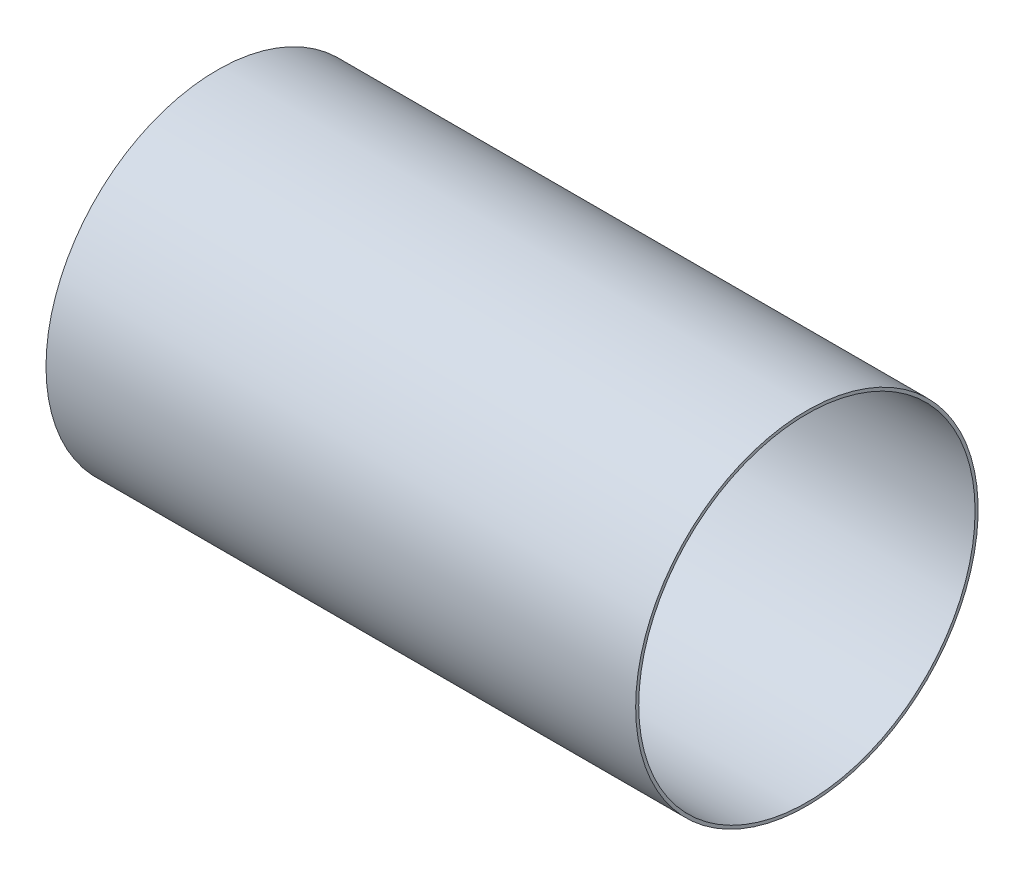
ISO-10303-21;
HEADER;
FILE_DESCRIPTION(('STEP AP214'),'2;1');
FILE_NAME('part.step','',(''),(''),'','','');
FILE_SCHEMA(('AUTOMOTIVE_DESIGN { 1 0 10303 214 1 1 1 1 }'));
ENDSEC;
DATA;
#1=APPLICATION_CONTEXT('core data for automotive mechanical design processes');
#2=APPLICATION_PROTOCOL_DEFINITION('international standard','automotive_design',2000,#1);
#3=PRODUCT_CONTEXT('',#1,'mechanical');
#4=PRODUCT('Part','Part','',(#3));
#5=PRODUCT_RELATED_PRODUCT_CATEGORY('part','',(#4));
#6=PRODUCT_DEFINITION_FORMATION('','',#4);
#7=PRODUCT_DEFINITION_CONTEXT('part definition',#1,'design');
#8=PRODUCT_DEFINITION('design','',#6,#7);
#9=PRODUCT_DEFINITION_SHAPE('','',#8);
#10=(LENGTH_UNIT() NAMED_UNIT(*) SI_UNIT(.MILLI.,.METRE.));
#11=(NAMED_UNIT(*) PLANE_ANGLE_UNIT() SI_UNIT($,.RADIAN.));
#12=(NAMED_UNIT(*) SI_UNIT($,.STERADIAN.) SOLID_ANGLE_UNIT());
#13=UNCERTAINTY_MEASURE_WITH_UNIT(LENGTH_MEASURE(1.E-05),#10,'distance_accuracy_value','');
#14=(GEOMETRIC_REPRESENTATION_CONTEXT(3) GLOBAL_UNCERTAINTY_ASSIGNED_CONTEXT((#13)) GLOBAL_UNIT_ASSIGNED_CONTEXT((#10,
#11,#12)) REPRESENTATION_CONTEXT('',''));
#15=CARTESIAN_POINT('',(0.,0.,0.));
#16=DIRECTION('',(0.,0.,1.));
#17=DIRECTION('',(1.,0.,0.));
#18=AXIS2_PLACEMENT_3D('',#15,#16,#17);
#19=CARTESIAN_POINT('',(304.8,0.,0.));
#20=DIRECTION('',(1.,0.,0.));
#21=DIRECTION('',(0.,0.,-1.));
#22=AXIS2_PLACEMENT_3D('',#19,#20,#21);
#23=PLANE('',#22);
#24=CARTESIAN_POINT('',(304.8,0.,0.));
#25=DIRECTION('',(1.,0.,0.));
#26=DIRECTION('',(0.,0.,-1.));
#27=AXIS2_PLACEMENT_3D('',#24,#25,#26);
#28=CIRCLE('',#27,88.519);
#29=CARTESIAN_POINT('',(304.8,0.,88.519));
#30=VERTEX_POINT('',#29);
#31=EDGE_CURVE('E10',#30,#30,#28,.T.);
#32=ORIENTED_EDGE('',*,*,#31,.T.);
#33=EDGE_LOOP('',(#32));
#34=FACE_BOUND('',#33,.T.);
#35=CARTESIAN_POINT('',(304.8,0.,0.));
#36=DIRECTION('',(1.,0.,0.));
#37=DIRECTION('',(0.,0.,-1.));
#38=AXIS2_PLACEMENT_3D('',#35,#36,#37);
#39=CIRCLE('',#38,86.9315);
#40=CARTESIAN_POINT('',(304.8,0.,86.9315));
#41=VERTEX_POINT('',#40);
#42=EDGE_CURVE('E56',#41,#41,#39,.T.);
#43=ORIENTED_EDGE('',*,*,#42,.F.);
#44=EDGE_LOOP('',(#43));
#45=FACE_BOUND('',#44,.T.);
#46=ADVANCED_FACE('F43',(#34,#45),#23,.T.);
#47=CARTESIAN_POINT('',(0.,0.,0.));
#48=DIRECTION('',(1.,0.,0.));
#49=DIRECTION('',(0.,0.,-1.));
#50=AXIS2_PLACEMENT_3D('',#47,#48,#49);
#51=PLANE('',#50);
#52=CARTESIAN_POINT('',(0.,0.,0.));
#53=DIRECTION('',(1.,0.,0.));
#54=DIRECTION('',(0.,0.,-1.));
#55=AXIS2_PLACEMENT_3D('',#52,#53,#54);
#56=CIRCLE('',#55,88.519);
#57=CARTESIAN_POINT('',(0.,0.,88.519));
#58=VERTEX_POINT('',#57);
#59=EDGE_CURVE('E47',#58,#58,#56,.T.);
#60=ORIENTED_EDGE('',*,*,#59,.F.);
#61=EDGE_LOOP('',(#60));
#62=FACE_BOUND('',#61,.T.);
#63=CARTESIAN_POINT('',(0.,0.,0.));
#64=DIRECTION('',(1.,0.,0.));
#65=DIRECTION('',(0.,0.,-1.));
#66=AXIS2_PLACEMENT_3D('',#63,#64,#65);
#67=CIRCLE('',#66,86.9315);
#68=CARTESIAN_POINT('',(0.,0.,86.9315));
#69=VERTEX_POINT('',#68);
#70=EDGE_CURVE('E58',#69,#69,#67,.T.);
#71=ORIENTED_EDGE('',*,*,#70,.T.);
#72=EDGE_LOOP('',(#71));
#73=FACE_BOUND('',#72,.T.);
#74=ADVANCED_FACE('F70',(#62,#73),#51,.F.);
#75=CARTESIAN_POINT('',(304.8,0.,0.));
#76=DIRECTION('',(-1.,0.,0.));
#77=DIRECTION('',(0.,0.,1.));
#78=AXIS2_PLACEMENT_3D('',#75,#76,#77);
#79=CYLINDRICAL_SURFACE('',#78,88.519);
#80=CARTESIAN_POINT('',(304.8,0.,88.519));
#81=CARTESIAN_POINT('',(301.625,0.,88.519));
#82=CARTESIAN_POINT('',(298.45,0.,88.519));
#83=CARTESIAN_POINT('',(292.1,0.,88.519));
#84=CARTESIAN_POINT('',(288.925,0.,88.519));
#85=CARTESIAN_POINT('',(282.575,0.,88.519));
#86=CARTESIAN_POINT('',(279.4,0.,88.519));
#87=CARTESIAN_POINT('',(273.05,0.,88.519));
#88=CARTESIAN_POINT('',(269.875,0.,88.519));
#89=CARTESIAN_POINT('',(263.525,0.,88.519));
#90=CARTESIAN_POINT('',(260.35,0.,88.519));
#91=CARTESIAN_POINT('',(254.,0.,88.519));
#92=CARTESIAN_POINT('',(250.825,0.,88.519));
#93=CARTESIAN_POINT('',(244.475,0.,88.519));
#94=CARTESIAN_POINT('',(241.3,0.,88.519));
#95=CARTESIAN_POINT('',(234.95,0.,88.519));
#96=CARTESIAN_POINT('',(231.775,0.,88.519));
#97=CARTESIAN_POINT('',(225.425,0.,88.519));
#98=CARTESIAN_POINT('',(222.25,0.,88.519));
#99=CARTESIAN_POINT('',(215.9,0.,88.519));
#100=CARTESIAN_POINT('',(212.725,0.,88.519));
#101=CARTESIAN_POINT('',(206.375,0.,88.519));
#102=CARTESIAN_POINT('',(203.2,0.,88.519));
#103=CARTESIAN_POINT('',(196.85,0.,88.519));
#104=CARTESIAN_POINT('',(193.675,0.,88.519));
#105=CARTESIAN_POINT('',(187.325,0.,88.519));
#106=CARTESIAN_POINT('',(184.15,0.,88.519));
#107=CARTESIAN_POINT('',(177.8,0.,88.519));
#108=CARTESIAN_POINT('',(174.625,0.,88.519));
#109=CARTESIAN_POINT('',(168.275,0.,88.519));
#110=CARTESIAN_POINT('',(165.1,0.,88.519));
#111=CARTESIAN_POINT('',(158.75,0.,88.519));
#112=CARTESIAN_POINT('',(155.575,0.,88.519));
#113=CARTESIAN_POINT('',(149.225,0.,88.519));
#114=CARTESIAN_POINT('',(146.05,0.,88.519));
#115=CARTESIAN_POINT('',(139.7,0.,88.519));
#116=CARTESIAN_POINT('',(136.525,0.,88.519));
#117=CARTESIAN_POINT('',(130.175,0.,88.519));
#118=CARTESIAN_POINT('',(127.,0.,88.519));
#119=CARTESIAN_POINT('',(120.65,0.,88.519));
#120=CARTESIAN_POINT('',(117.475,0.,88.519));
#121=CARTESIAN_POINT('',(111.125,0.,88.519));
#122=CARTESIAN_POINT('',(107.95,0.,88.519));
#123=CARTESIAN_POINT('',(101.6,0.,88.519));
#124=CARTESIAN_POINT('',(98.425,0.,88.519));
#125=CARTESIAN_POINT('',(92.075,0.,88.519));
#126=CARTESIAN_POINT('',(88.9,0.,88.519));
#127=CARTESIAN_POINT('',(82.55,0.,88.519));
#128=CARTESIAN_POINT('',(79.375,0.,88.519));
#129=CARTESIAN_POINT('',(73.025,0.,88.519));
#130=CARTESIAN_POINT('',(69.85,0.,88.519));
#131=CARTESIAN_POINT('',(63.5,0.,88.519));
#132=CARTESIAN_POINT('',(60.325,0.,88.519));
#133=CARTESIAN_POINT('',(53.975,0.,88.519));
#134=CARTESIAN_POINT('',(50.8,0.,88.519));
#135=CARTESIAN_POINT('',(44.45,0.,88.519));
#136=CARTESIAN_POINT('',(41.275,0.,88.519));
#137=CARTESIAN_POINT('',(34.925,0.,88.519));
#138=CARTESIAN_POINT('',(31.75,0.,88.519));
#139=CARTESIAN_POINT('',(25.4,0.,88.519));
#140=CARTESIAN_POINT('',(22.225,0.,88.519));
#141=CARTESIAN_POINT('',(15.875,0.,88.519));
#142=CARTESIAN_POINT('',(12.7,0.,88.519));
#143=CARTESIAN_POINT('',(6.35,0.,88.519));
#144=CARTESIAN_POINT('',(3.175,0.,88.519));
#145=CARTESIAN_POINT('',(0.,0.,88.519));
#146=B_SPLINE_CURVE_WITH_KNOTS('',3,(#80,#81,#82,#83,#84,#85,#86,#87,#88,#89,#90,#91,#92,#93,
#94,#95,#96,#97,#98,#99,#100,#101,#102,#103,#104,#105,#106,#107,#108,#109,#110,#111,#112,#113,
#114,#115,#116,#117,#118,#119,#120,#121,#122,#123,#124,#125,#126,#127,#128,#129,#130,#131,#132,
#133,#134,#135,#136,#137,#138,#139,#140,#141,#142,#143,#144,#145),.UNSPECIFIED.,.F.,.F.,(4,2,2,
2,2,2,2,2,2,2,2,2,2,2,2,2,2,2,2,2,2,2,2,2,2,2,2,2,2,2,2,2,4),(0.,9.52500000000001,19.05,28.575,
38.1,47.625,57.15,66.675,76.2,85.7250000000001,95.2500000000001,104.775,114.3,123.825,133.35,
142.875,152.4,161.925,171.45,180.975,190.5,200.025,209.55,219.075,228.6,238.125,247.65,257.175,
266.7,276.225,285.75,295.275,304.8),.UNSPECIFIED.);
#147=EDGE_CURVE('BSEAM45',#30,#58,#146,.T.);
#148=ORIENTED_EDGE('',*,*,#31,.F.);
#149=ORIENTED_EDGE('',*,*,#59,.T.);
#150=ORIENTED_EDGE('',*,*,#147,.T.);
#151=ORIENTED_EDGE('',*,*,#147,.F.);
#152=EDGE_LOOP('',(#148,#150,#149,#151));
#153=FACE_BOUND('',#152,.T.);
#154=ADVANCED_FACE('F45',(#153),#79,.T.);
#155=CARTESIAN_POINT('',(304.8,0.,0.));
#156=DIRECTION('',(-1.,0.,0.));
#157=DIRECTION('',(0.,0.,1.));
#158=AXIS2_PLACEMENT_3D('',#155,#156,#157);
#159=CYLINDRICAL_SURFACE('',#158,86.9315);
#160=CARTESIAN_POINT('',(304.8,0.,86.9315));
#161=CARTESIAN_POINT('',(301.625,0.,86.9315));
#162=CARTESIAN_POINT('',(298.45,0.,86.9315));
#163=CARTESIAN_POINT('',(292.1,0.,86.9315));
#164=CARTESIAN_POINT('',(288.925,0.,86.9315));
#165=CARTESIAN_POINT('',(282.575,0.,86.9315));
#166=CARTESIAN_POINT('',(279.4,0.,86.9315));
#167=CARTESIAN_POINT('',(273.05,0.,86.9315));
#168=CARTESIAN_POINT('',(269.875,0.,86.9315));
#169=CARTESIAN_POINT('',(263.525,0.,86.9315));
#170=CARTESIAN_POINT('',(260.35,0.,86.9315));
#171=CARTESIAN_POINT('',(254.,0.,86.9315));
#172=CARTESIAN_POINT('',(250.825,0.,86.9315));
#173=CARTESIAN_POINT('',(244.475,0.,86.9315));
#174=CARTESIAN_POINT('',(241.3,0.,86.9315));
#175=CARTESIAN_POINT('',(234.95,0.,86.9315));
#176=CARTESIAN_POINT('',(231.775,0.,86.9315));
#177=CARTESIAN_POINT('',(225.425,0.,86.9315));
#178=CARTESIAN_POINT('',(222.25,0.,86.9315));
#179=CARTESIAN_POINT('',(215.9,0.,86.9315));
#180=CARTESIAN_POINT('',(212.725,0.,86.9315));
#181=CARTESIAN_POINT('',(206.375,0.,86.9315));
#182=CARTESIAN_POINT('',(203.2,0.,86.9315));
#183=CARTESIAN_POINT('',(196.85,0.,86.9315));
#184=CARTESIAN_POINT('',(193.675,0.,86.9315));
#185=CARTESIAN_POINT('',(187.325,0.,86.9315));
#186=CARTESIAN_POINT('',(184.15,0.,86.9315));
#187=CARTESIAN_POINT('',(177.8,0.,86.9315));
#188=CARTESIAN_POINT('',(174.625,0.,86.9315));
#189=CARTESIAN_POINT('',(168.275,0.,86.9315));
#190=CARTESIAN_POINT('',(165.1,0.,86.9315));
#191=CARTESIAN_POINT('',(158.75,0.,86.9315));
#192=CARTESIAN_POINT('',(155.575,0.,86.9315));
#193=CARTESIAN_POINT('',(149.225,0.,86.9315));
#194=CARTESIAN_POINT('',(146.05,0.,86.9315));
#195=CARTESIAN_POINT('',(139.7,0.,86.9315));
#196=CARTESIAN_POINT('',(136.525,0.,86.9315));
#197=CARTESIAN_POINT('',(130.175,0.,86.9315));
#198=CARTESIAN_POINT('',(127.,0.,86.9315));
#199=CARTESIAN_POINT('',(120.65,0.,86.9315));
#200=CARTESIAN_POINT('',(117.475,0.,86.9315));
#201=CARTESIAN_POINT('',(111.125,0.,86.9315));
#202=CARTESIAN_POINT('',(107.95,0.,86.9315));
#203=CARTESIAN_POINT('',(101.6,0.,86.9315));
#204=CARTESIAN_POINT('',(98.425,0.,86.9315));
#205=CARTESIAN_POINT('',(92.075,0.,86.9315));
#206=CARTESIAN_POINT('',(88.9,0.,86.9315));
#207=CARTESIAN_POINT('',(82.55,0.,86.9315));
#208=CARTESIAN_POINT('',(79.375,0.,86.9315));
#209=CARTESIAN_POINT('',(73.025,0.,86.9315));
#210=CARTESIAN_POINT('',(69.85,0.,86.9315));
#211=CARTESIAN_POINT('',(63.5,0.,86.9315));
#212=CARTESIAN_POINT('',(60.325,0.,86.9315));
#213=CARTESIAN_POINT('',(53.975,0.,86.9315));
#214=CARTESIAN_POINT('',(50.8,0.,86.9315));
#215=CARTESIAN_POINT('',(44.45,0.,86.9315));
#216=CARTESIAN_POINT('',(41.275,0.,86.9315));
#217=CARTESIAN_POINT('',(34.925,0.,86.9315));
#218=CARTESIAN_POINT('',(31.75,0.,86.9315));
#219=CARTESIAN_POINT('',(25.4,0.,86.9315));
#220=CARTESIAN_POINT('',(22.225,0.,86.9315));
#221=CARTESIAN_POINT('',(15.875,0.,86.9315));
#222=CARTESIAN_POINT('',(12.7,0.,86.9315));
#223=CARTESIAN_POINT('',(6.35,0.,86.9315));
#224=CARTESIAN_POINT('',(3.175,0.,86.9315));
#225=CARTESIAN_POINT('',(0.,0.,86.9315));
#226=B_SPLINE_CURVE_WITH_KNOTS('',3,(#160,#161,#162,#163,#164,#165,#166,#167,#168,#169,#170,
#171,#172,#173,#174,#175,#176,#177,#178,#179,#180,#181,#182,#183,#184,#185,#186,#187,#188,#189,
#190,#191,#192,#193,#194,#195,#196,#197,#198,#199,#200,#201,#202,#203,#204,#205,#206,#207,#208,
#209,#210,#211,#212,#213,#214,#215,#216,#217,#218,#219,#220,#221,#222,#223,#224,#225),
.UNSPECIFIED.,.F.,.F.,(4,2,2,2,2,2,2,2,2,2,2,2,2,2,2,2,2,2,2,2,2,2,2,2,2,2,2,2,2,2,2,2,4),(0.,
9.52499999999995,19.05,28.575,38.1,47.625,57.15,66.675,76.2,85.725,95.2499999999999,104.775,
114.3,123.825,133.35,142.875,152.4,161.925,171.45,180.975,190.5,200.025,209.55,219.075,228.6,
238.125,247.65,257.175,266.7,276.225,285.75,295.275,304.8),.UNSPECIFIED.);
#227=EDGE_CURVE('BSEAM66',#41,#69,#226,.T.);
#228=ORIENTED_EDGE('',*,*,#42,.T.);
#229=ORIENTED_EDGE('',*,*,#70,.F.);
#230=ORIENTED_EDGE('',*,*,#227,.T.);
#231=ORIENTED_EDGE('',*,*,#227,.F.);
#232=EDGE_LOOP('',(#228,#230,#229,#231));
#233=FACE_BOUND('',#232,.T.);
#234=ADVANCED_FACE('F66',(#233),#159,.F.);
#235=CLOSED_SHELL('',(#46,#74,#154,#234));
#236=MANIFOLD_SOLID_BREP('B2',#235);
#237=ADVANCED_BREP_SHAPE_REPRESENTATION('',(#18,#236),#14);
#238=SHAPE_DEFINITION_REPRESENTATION(#9,#237);
ENDSEC;
END-ISO-10303-21;
